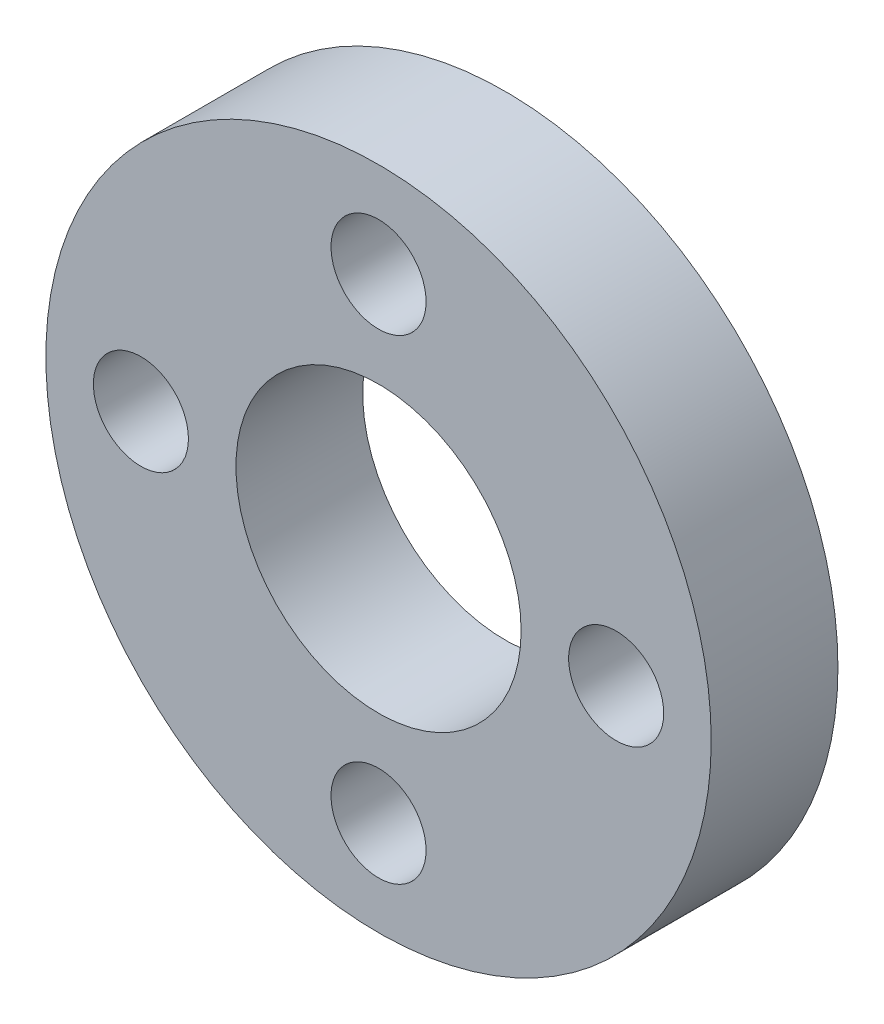
ISO-10303-21;
HEADER;
FILE_DESCRIPTION(('STEP AP214'),'2;1');
FILE_NAME('part.step','',(''),(''),'','','');
FILE_SCHEMA(('AUTOMOTIVE_DESIGN { 1 0 10303 214 1 1 1 1 }'));
ENDSEC;
DATA;
#1=APPLICATION_CONTEXT('core data for automotive mechanical design processes');
#2=APPLICATION_PROTOCOL_DEFINITION('international standard','automotive_design',2000,#1);
#3=PRODUCT_CONTEXT('',#1,'mechanical');
#4=PRODUCT('Part','Part','',(#3));
#5=PRODUCT_RELATED_PRODUCT_CATEGORY('part','',(#4));
#6=PRODUCT_DEFINITION_FORMATION('','',#4);
#7=PRODUCT_DEFINITION_CONTEXT('part definition',#1,'design');
#8=PRODUCT_DEFINITION('design','',#6,#7);
#9=PRODUCT_DEFINITION_SHAPE('','',#8);
#10=(LENGTH_UNIT() NAMED_UNIT(*) SI_UNIT(.MILLI.,.METRE.));
#11=(NAMED_UNIT(*) PLANE_ANGLE_UNIT() SI_UNIT($,.RADIAN.));
#12=(NAMED_UNIT(*) SI_UNIT($,.STERADIAN.) SOLID_ANGLE_UNIT());
#13=UNCERTAINTY_MEASURE_WITH_UNIT(LENGTH_MEASURE(1.E-05),#10,'distance_accuracy_value','');
#14=(GEOMETRIC_REPRESENTATION_CONTEXT(3) GLOBAL_UNCERTAINTY_ASSIGNED_CONTEXT((#13)) GLOBAL_UNIT_ASSIGNED_CONTEXT((#10,
#11,#12)) REPRESENTATION_CONTEXT('',''));
#15=CARTESIAN_POINT('',(0.,0.,0.));
#16=DIRECTION('',(0.,0.,1.));
#17=DIRECTION('',(1.,0.,0.));
#18=AXIS2_PLACEMENT_3D('',#15,#16,#17);
#19=CARTESIAN_POINT('',(0.,0.,4.));
#20=DIRECTION('',(0.,0.,1.));
#21=DIRECTION('',(1.,0.,0.));
#22=AXIS2_PLACEMENT_3D('',#19,#20,#21);
#23=PLANE('',#22);
#24=CARTESIAN_POINT('',(0.,-7.50000000000006,4.));
#25=DIRECTION('',(0.,0.,1.));
#26=DIRECTION('',(1.,0.,0.));
#27=AXIS2_PLACEMENT_3D('',#24,#25,#26);
#28=CIRCLE('',#27,1.50000000000006);
#29=CARTESIAN_POINT('',(1.50000000000006,-7.50000000000006,4.));
#30=VERTEX_POINT('',#29);
#31=EDGE_CURVE('E58',#30,#30,#28,.T.);
#32=ORIENTED_EDGE('',*,*,#31,.F.);
#33=EDGE_LOOP('',(#32));
#34=FACE_BOUND('',#33,.T.);
#35=CARTESIAN_POINT('',(0.,7.49999999999984,4.));
#36=DIRECTION('',(0.,0.,1.));
#37=DIRECTION('',(1.,0.,0.));
#38=AXIS2_PLACEMENT_3D('',#35,#36,#37);
#39=CIRCLE('',#38,1.50000000000006);
#40=CARTESIAN_POINT('',(1.50000000000006,7.49999999999984,4.));
#41=VERTEX_POINT('',#40);
#42=EDGE_CURVE('E46',#41,#41,#39,.T.);
#43=ORIENTED_EDGE('',*,*,#42,.F.);
#44=EDGE_LOOP('',(#43));
#45=FACE_BOUND('',#44,.T.);
#46=CARTESIAN_POINT('',(0.,0.,4.));
#47=DIRECTION('',(0.,0.,1.));
#48=DIRECTION('',(1.,0.,0.));
#49=AXIS2_PLACEMENT_3D('',#46,#47,#48);
#50=CIRCLE('',#49,10.5);
#51=CARTESIAN_POINT('',(10.5,0.,4.));
#52=VERTEX_POINT('',#51);
#53=EDGE_CURVE('E10',#52,#52,#50,.T.);
#54=ORIENTED_EDGE('',*,*,#53,.T.);
#55=EDGE_LOOP('',(#54));
#56=FACE_BOUND('',#55,.T.);
#57=CARTESIAN_POINT('',(-7.49999999999984,0.,4.));
#58=DIRECTION('',(0.,0.,1.));
#59=DIRECTION('',(1.,0.,0.));
#60=AXIS2_PLACEMENT_3D('',#57,#58,#59);
#61=CIRCLE('',#60,1.49999999999963);
#62=CARTESIAN_POINT('',(-6.00000000000021,0.,4.));
#63=VERTEX_POINT('',#62);
#64=EDGE_CURVE('E41',#63,#63,#61,.T.);
#65=ORIENTED_EDGE('',*,*,#64,.F.);
#66=EDGE_LOOP('',(#65));
#67=FACE_BOUND('',#66,.T.);
#68=CARTESIAN_POINT('',(7.49999999999984,0.,4.));
#69=DIRECTION('',(0.,0.,1.));
#70=DIRECTION('',(1.,0.,0.));
#71=AXIS2_PLACEMENT_3D('',#68,#69,#70);
#72=CIRCLE('',#71,1.50000000000006);
#73=CARTESIAN_POINT('',(8.9999999999999,0.,4.));
#74=VERTEX_POINT('',#73);
#75=EDGE_CURVE('E52',#74,#74,#72,.T.);
#76=ORIENTED_EDGE('',*,*,#75,.F.);
#77=EDGE_LOOP('',(#76));
#78=FACE_BOUND('',#77,.T.);
#79=CARTESIAN_POINT('',(0.,0.,4.));
#80=DIRECTION('',(0.,0.,1.));
#81=DIRECTION('',(1.,0.,0.));
#82=AXIS2_PLACEMENT_3D('',#79,#80,#81);
#83=CIRCLE('',#82,4.50000000000017);
#84=CARTESIAN_POINT('',(4.50000000000017,0.,4.));
#85=VERTEX_POINT('',#84);
#86=EDGE_CURVE('E64',#85,#85,#83,.T.);
#87=ORIENTED_EDGE('',*,*,#86,.F.);
#88=EDGE_LOOP('',(#87));
#89=FACE_BOUND('',#88,.T.);
#90=ADVANCED_FACE('F30',(#34,#45,#56,#67,#78,#89),#23,.T.);
#91=CARTESIAN_POINT('',(0.,0.,0.));
#92=DIRECTION('',(0.,0.,1.));
#93=DIRECTION('',(1.,0.,0.));
#94=AXIS2_PLACEMENT_3D('',#91,#92,#93);
#95=PLANE('',#94);
#96=CARTESIAN_POINT('',(0.,-7.50000000000006,0.));
#97=DIRECTION('',(0.,0.,1.));
#98=DIRECTION('',(1.,0.,0.));
#99=AXIS2_PLACEMENT_3D('',#96,#97,#98);
#100=CIRCLE('',#99,1.50000000000006);
#101=CARTESIAN_POINT('',(1.50000000000006,-7.50000000000006,0.));
#102=VERTEX_POINT('',#101);
#103=EDGE_CURVE('E61',#102,#102,#100,.T.);
#104=ORIENTED_EDGE('',*,*,#103,.T.);
#105=EDGE_LOOP('',(#104));
#106=FACE_BOUND('',#105,.T.);
#107=CARTESIAN_POINT('',(0.,7.49999999999984,0.));
#108=DIRECTION('',(0.,0.,1.));
#109=DIRECTION('',(1.,0.,0.));
#110=AXIS2_PLACEMENT_3D('',#107,#108,#109);
#111=CIRCLE('',#110,1.50000000000006);
#112=CARTESIAN_POINT('',(1.50000000000006,7.49999999999984,0.));
#113=VERTEX_POINT('',#112);
#114=EDGE_CURVE('E49',#113,#113,#111,.T.);
#115=ORIENTED_EDGE('',*,*,#114,.T.);
#116=EDGE_LOOP('',(#115));
#117=FACE_BOUND('',#116,.T.);
#118=CARTESIAN_POINT('',(0.,0.,0.));
#119=DIRECTION('',(0.,0.,1.));
#120=DIRECTION('',(1.,0.,0.));
#121=AXIS2_PLACEMENT_3D('',#118,#119,#120);
#122=CIRCLE('',#121,10.5);
#123=CARTESIAN_POINT('',(10.5,0.,0.));
#124=VERTEX_POINT('',#123);
#125=EDGE_CURVE('E34',#124,#124,#122,.T.);
#126=ORIENTED_EDGE('',*,*,#125,.F.);
#127=EDGE_LOOP('',(#126));
#128=FACE_BOUND('',#127,.T.);
#129=CARTESIAN_POINT('',(-7.49999999999984,0.,0.));
#130=DIRECTION('',(0.,0.,1.));
#131=DIRECTION('',(1.,0.,0.));
#132=AXIS2_PLACEMENT_3D('',#129,#130,#131);
#133=CIRCLE('',#132,1.49999999999963);
#134=CARTESIAN_POINT('',(-6.00000000000021,0.,0.));
#135=VERTEX_POINT('',#134);
#136=EDGE_CURVE('E43',#135,#135,#133,.T.);
#137=ORIENTED_EDGE('',*,*,#136,.T.);
#138=EDGE_LOOP('',(#137));
#139=FACE_BOUND('',#138,.T.);
#140=CARTESIAN_POINT('',(7.49999999999984,0.,0.));
#141=DIRECTION('',(0.,0.,1.));
#142=DIRECTION('',(1.,0.,0.));
#143=AXIS2_PLACEMENT_3D('',#140,#141,#142);
#144=CIRCLE('',#143,1.50000000000006);
#145=CARTESIAN_POINT('',(8.9999999999999,0.,0.));
#146=VERTEX_POINT('',#145);
#147=EDGE_CURVE('E55',#146,#146,#144,.T.);
#148=ORIENTED_EDGE('',*,*,#147,.T.);
#149=EDGE_LOOP('',(#148));
#150=FACE_BOUND('',#149,.T.);
#151=CARTESIAN_POINT('',(0.,0.,0.));
#152=DIRECTION('',(0.,0.,1.));
#153=DIRECTION('',(1.,0.,0.));
#154=AXIS2_PLACEMENT_3D('',#151,#152,#153);
#155=CIRCLE('',#154,4.50000000000017);
#156=CARTESIAN_POINT('',(4.50000000000017,0.,0.));
#157=VERTEX_POINT('',#156);
#158=EDGE_CURVE('E67',#157,#157,#155,.T.);
#159=ORIENTED_EDGE('',*,*,#158,.T.);
#160=EDGE_LOOP('',(#159));
#161=FACE_BOUND('',#160,.T.);
#162=ADVANCED_FACE('F77',(#106,#117,#128,#139,#150,#161),#95,.F.);
#163=CARTESIAN_POINT('',(0.,0.,4.));
#164=DIRECTION('',(0.,0.,-1.));
#165=DIRECTION('',(-1.,0.,0.));
#166=AXIS2_PLACEMENT_3D('',#163,#164,#165);
#167=CYLINDRICAL_SURFACE('',#166,10.5);
#168=ORIENTED_EDGE('',*,*,#53,.F.);
#169=EDGE_LOOP('',(#168));
#170=FACE_BOUND('',#169,.T.);
#171=ORIENTED_EDGE('',*,*,#125,.T.);
#172=EDGE_LOOP('',(#171));
#173=FACE_BOUND('',#172,.T.);
#174=ADVANCED_FACE('F32',(#170,#173),#167,.T.);
#175=CARTESIAN_POINT('',(-7.49999999999984,0.,4.));
#176=DIRECTION('',(0.,0.,-1.));
#177=DIRECTION('',(-1.,0.,0.));
#178=AXIS2_PLACEMENT_3D('',#175,#176,#177);
#179=CYLINDRICAL_SURFACE('',#178,1.49999999999963);
#180=ORIENTED_EDGE('',*,*,#64,.T.);
#181=EDGE_LOOP('',(#180));
#182=FACE_BOUND('',#181,.T.);
#183=ORIENTED_EDGE('',*,*,#136,.F.);
#184=EDGE_LOOP('',(#183));
#185=FACE_BOUND('',#184,.T.);
#186=ADVANCED_FACE('F87',(#182,#185),#179,.F.);
#187=CARTESIAN_POINT('',(0.,7.49999999999984,4.));
#188=DIRECTION('',(0.,0.,-1.));
#189=DIRECTION('',(-1.,0.,0.));
#190=AXIS2_PLACEMENT_3D('',#187,#188,#189);
#191=CYLINDRICAL_SURFACE('',#190,1.50000000000006);
#192=ORIENTED_EDGE('',*,*,#42,.T.);
#193=EDGE_LOOP('',(#192));
#194=FACE_BOUND('',#193,.T.);
#195=ORIENTED_EDGE('',*,*,#114,.F.);
#196=EDGE_LOOP('',(#195));
#197=FACE_BOUND('',#196,.T.);
#198=ADVANCED_FACE('F90',(#194,#197),#191,.F.);
#199=CARTESIAN_POINT('',(7.49999999999984,0.,4.));
#200=DIRECTION('',(0.,0.,-1.));
#201=DIRECTION('',(-1.,0.,0.));
#202=AXIS2_PLACEMENT_3D('',#199,#200,#201);
#203=CYLINDRICAL_SURFACE('',#202,1.50000000000006);
#204=ORIENTED_EDGE('',*,*,#75,.T.);
#205=EDGE_LOOP('',(#204));
#206=FACE_BOUND('',#205,.T.);
#207=ORIENTED_EDGE('',*,*,#147,.F.);
#208=EDGE_LOOP('',(#207));
#209=FACE_BOUND('',#208,.T.);
#210=ADVANCED_FACE('F94',(#206,#209),#203,.F.);
#211=CARTESIAN_POINT('',(0.,-7.50000000000006,4.));
#212=DIRECTION('',(0.,0.,-1.));
#213=DIRECTION('',(-1.,0.,0.));
#214=AXIS2_PLACEMENT_3D('',#211,#212,#213);
#215=CYLINDRICAL_SURFACE('',#214,1.50000000000006);
#216=ORIENTED_EDGE('',*,*,#31,.T.);
#217=EDGE_LOOP('',(#216));
#218=FACE_BOUND('',#217,.T.);
#219=ORIENTED_EDGE('',*,*,#103,.F.);
#220=EDGE_LOOP('',(#219));
#221=FACE_BOUND('',#220,.T.);
#222=ADVANCED_FACE('F98',(#218,#221),#215,.F.);
#223=CARTESIAN_POINT('',(0.,0.,4.));
#224=DIRECTION('',(0.,0.,-1.));
#225=DIRECTION('',(-1.,0.,0.));
#226=AXIS2_PLACEMENT_3D('',#223,#224,#225);
#227=CYLINDRICAL_SURFACE('',#226,4.50000000000017);
#228=ORIENTED_EDGE('',*,*,#86,.T.);
#229=EDGE_LOOP('',(#228));
#230=FACE_BOUND('',#229,.T.);
#231=ORIENTED_EDGE('',*,*,#158,.F.);
#232=EDGE_LOOP('',(#231));
#233=FACE_BOUND('',#232,.T.);
#234=ADVANCED_FACE('F73',(#230,#233),#227,.F.);
#235=CLOSED_SHELL('',(#90,#162,#174,#186,#198,#210,#222,#234));
#236=MANIFOLD_SOLID_BREP('B2',#235);
#237=ADVANCED_BREP_SHAPE_REPRESENTATION('',(#18,#236),#14);
#238=SHAPE_DEFINITION_REPRESENTATION(#9,#237);
ENDSEC;
END-ISO-10303-21;
